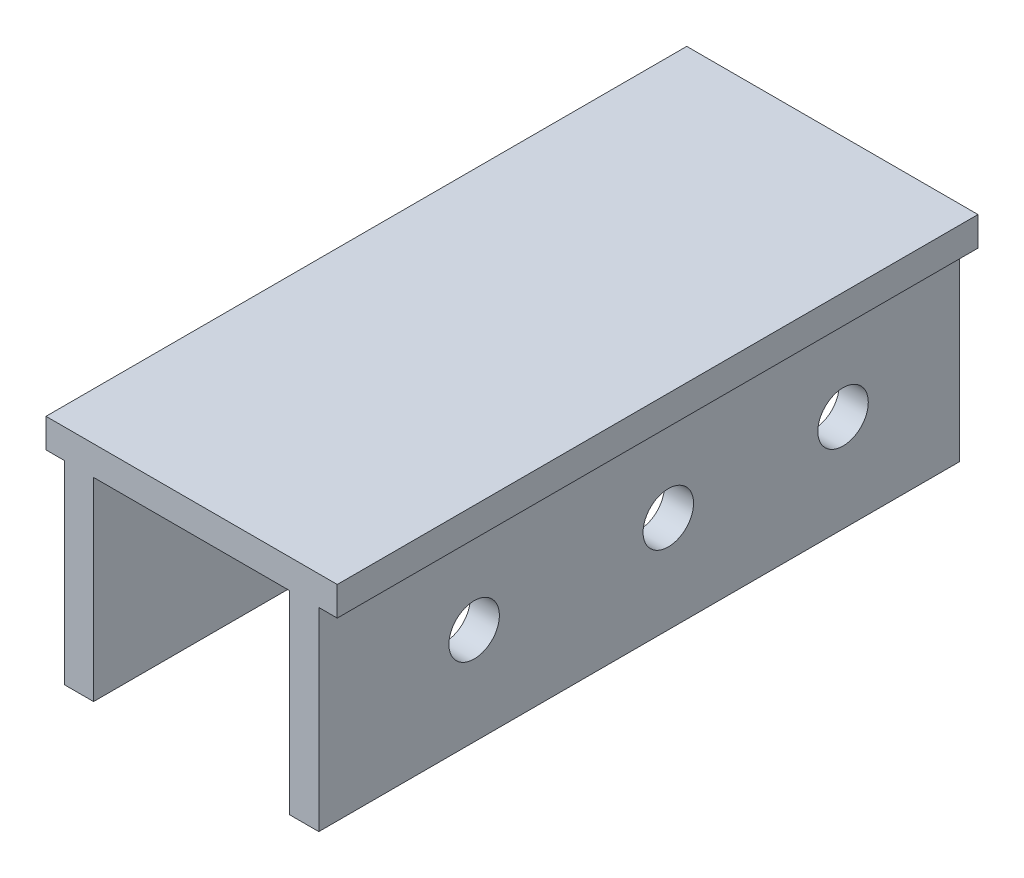
ISO-10303-21;
HEADER;
FILE_DESCRIPTION(('STEP AP214'),'2;1');
FILE_NAME('part.step','',(''),(''),'','','');
FILE_SCHEMA(('AUTOMOTIVE_DESIGN { 1 0 10303 214 1 1 1 1 }'));
ENDSEC;
DATA;
#1=APPLICATION_CONTEXT('core data for automotive mechanical design processes');
#2=APPLICATION_PROTOCOL_DEFINITION('international standard','automotive_design',2000,#1);
#3=PRODUCT_CONTEXT('',#1,'mechanical');
#4=PRODUCT('Part','Part','',(#3));
#5=PRODUCT_RELATED_PRODUCT_CATEGORY('part','',(#4));
#6=PRODUCT_DEFINITION_FORMATION('','',#4);
#7=PRODUCT_DEFINITION_CONTEXT('part definition',#1,'design');
#8=PRODUCT_DEFINITION('design','',#6,#7);
#9=PRODUCT_DEFINITION_SHAPE('','',#8);
#10=(LENGTH_UNIT() NAMED_UNIT(*) SI_UNIT(.MILLI.,.METRE.));
#11=(NAMED_UNIT(*) PLANE_ANGLE_UNIT() SI_UNIT($,.RADIAN.));
#12=(NAMED_UNIT(*) SI_UNIT($,.STERADIAN.) SOLID_ANGLE_UNIT());
#13=UNCERTAINTY_MEASURE_WITH_UNIT(LENGTH_MEASURE(1.E-05),#10,'distance_accuracy_value','');
#14=(GEOMETRIC_REPRESENTATION_CONTEXT(3) GLOBAL_UNCERTAINTY_ASSIGNED_CONTEXT((#13)) GLOBAL_UNIT_ASSIGNED_CONTEXT((#10,
#11,#12)) REPRESENTATION_CONTEXT('',''));
#15=CARTESIAN_POINT('',(0.,0.,0.));
#16=DIRECTION('',(0.,0.,1.));
#17=DIRECTION('',(1.,0.,0.));
#18=AXIS2_PLACEMENT_3D('',#15,#16,#17);
#19=CARTESIAN_POINT('',(15.,-1.5,66.));
#20=DIRECTION('',(-1.,0.,0.));
#21=DIRECTION('',(0.,0.,1.));
#22=AXIS2_PLACEMENT_3D('',#19,#20,#21);
#23=PLANE('',#22);
#24=DIRECTION('',(0.,1.,0.));
#25=VECTOR('',#24,1.);
#26=CARTESIAN_POINT('',(15.,-1.5,0.));
#27=LINE('',#26,#25);
#28=CARTESIAN_POINT('',(15.,-1.5,0.));
#29=VERTEX_POINT('',#28);
#30=CARTESIAN_POINT('',(15.,1.5,0.));
#31=VERTEX_POINT('',#30);
#32=EDGE_CURVE('E160',#29,#31,#27,.T.);
#33=ORIENTED_EDGE('',*,*,#32,.T.);
#34=DIRECTION('',(0.,0.,-1.));
#35=VECTOR('',#34,1.);
#36=CARTESIAN_POINT('',(15.,1.5,66.));
#37=LINE('',#36,#35);
#38=CARTESIAN_POINT('',(15.,1.5,66.));
#39=VERTEX_POINT('',#38);
#40=EDGE_CURVE('E11',#39,#31,#37,.T.);
#41=ORIENTED_EDGE('',*,*,#40,.F.);
#42=DIRECTION('',(0.,1.,0.));
#43=VECTOR('',#42,1.);
#44=CARTESIAN_POINT('',(15.,-1.5,66.));
#45=LINE('',#44,#43);
#46=CARTESIAN_POINT('',(15.,-1.5,66.));
#47=VERTEX_POINT('',#46);
#48=EDGE_CURVE('E183',#47,#39,#45,.T.);
#49=ORIENTED_EDGE('',*,*,#48,.F.);
#50=DIRECTION('',(0.,0.,-1.));
#51=VECTOR('',#50,1.);
#52=CARTESIAN_POINT('',(15.,-1.5,66.));
#53=LINE('',#52,#51);
#54=EDGE_CURVE('E156',#47,#29,#53,.T.);
#55=ORIENTED_EDGE('',*,*,#54,.T.);
#56=EDGE_LOOP('',(#33,#41,#49,#55));
#57=FACE_BOUND('',#56,.T.);
#58=ADVANCED_FACE('F39',(#57),#23,.F.);
#59=CARTESIAN_POINT('',(-15.,1.5,66.));
#60=DIRECTION('',(0.,-1.,0.));
#61=DIRECTION('',(0.,0.,-1.));
#62=AXIS2_PLACEMENT_3D('',#59,#60,#61);
#63=PLANE('',#62);
#64=DIRECTION('',(-1.,0.,0.));
#65=VECTOR('',#64,1.);
#66=CARTESIAN_POINT('',(-15.,1.5,0.));
#67=LINE('',#66,#65);
#68=CARTESIAN_POINT('',(-15.,1.5,0.));
#69=VERTEX_POINT('',#68);
#70=EDGE_CURVE('E163',#31,#69,#67,.T.);
#71=ORIENTED_EDGE('',*,*,#70,.T.);
#72=DIRECTION('',(0.,0.,-1.));
#73=VECTOR('',#72,1.);
#74=CARTESIAN_POINT('',(-15.,1.5,66.));
#75=LINE('',#74,#73);
#76=CARTESIAN_POINT('',(-15.,1.5,66.));
#77=VERTEX_POINT('',#76);
#78=EDGE_CURVE('E48',#77,#69,#75,.T.);
#79=ORIENTED_EDGE('',*,*,#78,.F.);
#80=DIRECTION('',(-1.,0.,0.));
#81=VECTOR('',#80,1.);
#82=CARTESIAN_POINT('',(-15.,1.5,66.));
#83=LINE('',#82,#81);
#84=EDGE_CURVE('E111',#39,#77,#83,.T.);
#85=ORIENTED_EDGE('',*,*,#84,.F.);
#86=ORIENTED_EDGE('',*,*,#40,.T.);
#87=EDGE_LOOP('',(#71,#79,#85,#86));
#88=FACE_BOUND('',#87,.T.);
#89=ADVANCED_FACE('F263',(#88),#63,.F.);
#90=CARTESIAN_POINT('',(-15.,-1.5,66.));
#91=DIRECTION('',(1.,0.,0.));
#92=DIRECTION('',(0.,0.,-1.));
#93=AXIS2_PLACEMENT_3D('',#90,#91,#92);
#94=PLANE('',#93);
#95=DIRECTION('',(0.,-1.,0.));
#96=VECTOR('',#95,1.);
#97=CARTESIAN_POINT('',(-15.,-1.5,0.));
#98=LINE('',#97,#96);
#99=CARTESIAN_POINT('',(-15.,-1.5,0.));
#100=VERTEX_POINT('',#99);
#101=EDGE_CURVE('E166',#69,#100,#98,.T.);
#102=ORIENTED_EDGE('',*,*,#101,.T.);
#103=DIRECTION('',(0.,0.,-1.));
#104=VECTOR('',#103,1.);
#105=CARTESIAN_POINT('',(-15.,-1.5,66.));
#106=LINE('',#105,#104);
#107=CARTESIAN_POINT('',(-15.,-1.5,66.));
#108=VERTEX_POINT('',#107);
#109=EDGE_CURVE('E202',#108,#100,#106,.T.);
#110=ORIENTED_EDGE('',*,*,#109,.F.);
#111=DIRECTION('',(0.,-1.,0.));
#112=VECTOR('',#111,1.);
#113=CARTESIAN_POINT('',(-15.,-1.5,66.));
#114=LINE('',#113,#112);
#115=EDGE_CURVE('E211',#77,#108,#114,.T.);
#116=ORIENTED_EDGE('',*,*,#115,.F.);
#117=ORIENTED_EDGE('',*,*,#78,.T.);
#118=EDGE_LOOP('',(#102,#110,#116,#117));
#119=FACE_BOUND('',#118,.T.);
#120=ADVANCED_FACE('F209',(#119),#94,.F.);
#121=CARTESIAN_POINT('',(-15.,-1.5,66.));
#122=DIRECTION('',(0.,1.,0.));
#123=DIRECTION('',(-1.,0.,0.));
#124=AXIS2_PLACEMENT_3D('',#121,#122,#123);
#125=PLANE('',#124);
#126=DIRECTION('',(1.,0.,0.));
#127=VECTOR('',#126,1.);
#128=CARTESIAN_POINT('',(-15.,-1.5,0.));
#129=LINE('',#128,#127);
#130=CARTESIAN_POINT('',(-13.1,-1.5,0.));
#131=VERTEX_POINT('',#130);
#132=EDGE_CURVE('E168',#100,#131,#129,.T.);
#133=ORIENTED_EDGE('',*,*,#132,.T.);
#134=DIRECTION('',(0.,0.,-1.));
#135=VECTOR('',#134,1.);
#136=CARTESIAN_POINT('',(-13.1,-1.5,66.));
#137=LINE('',#136,#135);
#138=CARTESIAN_POINT('',(-13.1,-1.5,66.));
#139=VERTEX_POINT('',#138);
#140=EDGE_CURVE('E199',#139,#131,#137,.T.);
#141=ORIENTED_EDGE('',*,*,#140,.F.);
#142=DIRECTION('',(1.,0.,0.));
#143=VECTOR('',#142,1.);
#144=CARTESIAN_POINT('',(-15.,-1.5,66.));
#145=LINE('',#144,#143);
#146=EDGE_CURVE('E229',#108,#139,#145,.T.);
#147=ORIENTED_EDGE('',*,*,#146,.F.);
#148=ORIENTED_EDGE('',*,*,#109,.T.);
#149=EDGE_LOOP('',(#133,#141,#147,#148));
#150=FACE_BOUND('',#149,.T.);
#151=ADVANCED_FACE('F220',(#150),#125,.F.);
#152=CARTESIAN_POINT('',(-13.1,-1.5,66.));
#153=DIRECTION('',(1.,0.,0.));
#154=DIRECTION('',(0.,1.,0.));
#155=AXIS2_PLACEMENT_3D('',#152,#153,#154);
#156=PLANE('',#155);
#157=CARTESIAN_POINT('',(-13.1,-11.5,50.));
#158=DIRECTION('',(1.,0.,0.));
#159=DIRECTION('',(0.,1.,0.));
#160=AXIS2_PLACEMENT_3D('',#157,#158,#159);
#161=CIRCLE('',#160,2.60000000000001);
#162=CARTESIAN_POINT('',(-13.1,-8.9,50.));
#163=VERTEX_POINT('',#162);
#164=EDGE_CURVE('E473',#163,#163,#161,.T.);
#165=ORIENTED_EDGE('',*,*,#164,.T.);
#166=EDGE_LOOP('',(#165));
#167=FACE_BOUND('',#166,.T.);
#168=CARTESIAN_POINT('',(-13.1,-11.5,30.));
#169=DIRECTION('',(1.,0.,0.));
#170=DIRECTION('',(0.,1.,0.));
#171=AXIS2_PLACEMENT_3D('',#168,#169,#170);
#172=CIRCLE('',#171,2.60000000000001);
#173=CARTESIAN_POINT('',(-13.1,-8.9,30.));
#174=VERTEX_POINT('',#173);
#175=EDGE_CURVE('E488',#174,#174,#172,.T.);
#176=ORIENTED_EDGE('',*,*,#175,.T.);
#177=EDGE_LOOP('',(#176));
#178=FACE_BOUND('',#177,.T.);
#179=CARTESIAN_POINT('',(-13.1,-11.5,12.));
#180=DIRECTION('',(1.,0.,0.));
#181=DIRECTION('',(0.,1.,0.));
#182=AXIS2_PLACEMENT_3D('',#179,#180,#181);
#183=CIRCLE('',#182,2.60000000000001);
#184=CARTESIAN_POINT('',(-13.1,-8.89999999999999,12.));
#185=VERTEX_POINT('',#184);
#186=EDGE_CURVE('E164',#185,#185,#183,.T.);
#187=ORIENTED_EDGE('',*,*,#186,.T.);
#188=EDGE_LOOP('',(#187));
#189=FACE_BOUND('',#188,.T.);
#190=DIRECTION('',(0.,-1.,0.));
#191=VECTOR('',#190,1.);
#192=CARTESIAN_POINT('',(-13.1,-1.5,0.));
#193=LINE('',#192,#191);
#194=CARTESIAN_POINT('',(-13.1,-21.5,0.));
#195=VERTEX_POINT('',#194);
#196=EDGE_CURVE('E170',#131,#195,#193,.T.);
#197=ORIENTED_EDGE('',*,*,#196,.T.);
#198=DIRECTION('',(0.,0.,-1.));
#199=VECTOR('',#198,1.);
#200=CARTESIAN_POINT('',(-13.1,-21.5,66.));
#201=LINE('',#200,#199);
#202=CARTESIAN_POINT('',(-13.1,-21.5,66.));
#203=VERTEX_POINT('',#202);
#204=EDGE_CURVE('E196',#203,#195,#201,.T.);
#205=ORIENTED_EDGE('',*,*,#204,.F.);
#206=DIRECTION('',(0.,-1.,0.));
#207=VECTOR('',#206,1.);
#208=CARTESIAN_POINT('',(-13.1,-1.5,66.));
#209=LINE('',#208,#207);
#210=EDGE_CURVE('E226',#139,#203,#209,.T.);
#211=ORIENTED_EDGE('',*,*,#210,.F.);
#212=ORIENTED_EDGE('',*,*,#140,.T.);
#213=EDGE_LOOP('',(#197,#205,#211,#212));
#214=FACE_BOUND('',#213,.T.);
#215=ADVANCED_FACE('F224',(#167,#178,#189,#214),#156,.F.);
#216=CARTESIAN_POINT('',(-13.1,-21.5,66.));
#217=DIRECTION('',(0.,1.,0.));
#218=DIRECTION('',(0.,0.,1.));
#219=AXIS2_PLACEMENT_3D('',#216,#217,#218);
#220=PLANE('',#219);
#221=DIRECTION('',(1.,0.,0.));
#222=VECTOR('',#221,1.);
#223=CARTESIAN_POINT('',(-13.1,-21.5,0.));
#224=LINE('',#223,#222);
#225=CARTESIAN_POINT('',(-10.1,-21.5,0.));
#226=VERTEX_POINT('',#225);
#227=EDGE_CURVE('E172',#195,#226,#224,.T.);
#228=ORIENTED_EDGE('',*,*,#227,.T.);
#229=DIRECTION('',(0.,0.,-1.));
#230=VECTOR('',#229,1.);
#231=CARTESIAN_POINT('',(-10.1,-21.5,66.));
#232=LINE('',#231,#230);
#233=CARTESIAN_POINT('',(-10.1,-21.5,66.));
#234=VERTEX_POINT('',#233);
#235=EDGE_CURVE('E193',#234,#226,#232,.T.);
#236=ORIENTED_EDGE('',*,*,#235,.F.);
#237=DIRECTION('',(1.,0.,0.));
#238=VECTOR('',#237,1.);
#239=CARTESIAN_POINT('',(-13.1,-21.5,66.));
#240=LINE('',#239,#238);
#241=EDGE_CURVE('E228',#203,#234,#240,.T.);
#242=ORIENTED_EDGE('',*,*,#241,.F.);
#243=ORIENTED_EDGE('',*,*,#204,.T.);
#244=EDGE_LOOP('',(#228,#236,#242,#243));
#245=FACE_BOUND('',#244,.T.);
#246=ADVANCED_FACE('F276',(#245),#220,.F.);
#247=CARTESIAN_POINT('',(-10.1,-1.5,66.));
#248=DIRECTION('',(-1.,0.,0.));
#249=DIRECTION('',(0.,-1.,0.));
#250=AXIS2_PLACEMENT_3D('',#247,#248,#249);
#251=PLANE('',#250);
#252=CARTESIAN_POINT('',(-10.1,-11.5,50.));
#253=DIRECTION('',(-1.,0.,0.));
#254=DIRECTION('',(0.,-1.,0.));
#255=AXIS2_PLACEMENT_3D('',#252,#253,#254);
#256=CIRCLE('',#255,2.60000000000001);
#257=CARTESIAN_POINT('',(-10.1,-14.1,50.));
#258=VERTEX_POINT('',#257);
#259=EDGE_CURVE('E470',#258,#258,#256,.T.);
#260=ORIENTED_EDGE('',*,*,#259,.T.);
#261=EDGE_LOOP('',(#260));
#262=FACE_BOUND('',#261,.T.);
#263=CARTESIAN_POINT('',(-10.1,-11.5,30.));
#264=DIRECTION('',(-1.,0.,0.));
#265=DIRECTION('',(0.,-1.,0.));
#266=AXIS2_PLACEMENT_3D('',#263,#264,#265);
#267=CIRCLE('',#266,2.60000000000001);
#268=CARTESIAN_POINT('',(-10.1,-14.1,30.));
#269=VERTEX_POINT('',#268);
#270=EDGE_CURVE('E485',#269,#269,#267,.T.);
#271=ORIENTED_EDGE('',*,*,#270,.T.);
#272=EDGE_LOOP('',(#271));
#273=FACE_BOUND('',#272,.T.);
#274=CARTESIAN_POINT('',(-10.1,-11.5,12.));
#275=DIRECTION('',(-1.,0.,0.));
#276=DIRECTION('',(0.,-1.,0.));
#277=AXIS2_PLACEMENT_3D('',#274,#275,#276);
#278=CIRCLE('',#277,2.60000000000001);
#279=CARTESIAN_POINT('',(-10.1,-14.1,12.));
#280=VERTEX_POINT('',#279);
#281=EDGE_CURVE('E494',#280,#280,#278,.T.);
#282=ORIENTED_EDGE('',*,*,#281,.T.);
#283=EDGE_LOOP('',(#282));
#284=FACE_BOUND('',#283,.T.);
#285=DIRECTION('',(0.,1.,0.));
#286=VECTOR('',#285,1.);
#287=CARTESIAN_POINT('',(-10.1,-1.5,0.));
#288=LINE('',#287,#286);
#289=CARTESIAN_POINT('',(-10.1,-1.5,0.));
#290=VERTEX_POINT('',#289);
#291=EDGE_CURVE('E174',#226,#290,#288,.T.);
#292=ORIENTED_EDGE('',*,*,#291,.T.);
#293=DIRECTION('',(0.,0.,-1.));
#294=VECTOR('',#293,1.);
#295=CARTESIAN_POINT('',(-10.1,-1.5,66.));
#296=LINE('',#295,#294);
#297=CARTESIAN_POINT('',(-10.1,-1.5,66.));
#298=VERTEX_POINT('',#297);
#299=EDGE_CURVE('E190',#298,#290,#296,.T.);
#300=ORIENTED_EDGE('',*,*,#299,.F.);
#301=DIRECTION('',(0.,1.,0.));
#302=VECTOR('',#301,1.);
#303=CARTESIAN_POINT('',(-10.1,-1.5,66.));
#304=LINE('',#303,#302);
#305=EDGE_CURVE('E231',#234,#298,#304,.T.);
#306=ORIENTED_EDGE('',*,*,#305,.F.);
#307=ORIENTED_EDGE('',*,*,#235,.T.);
#308=EDGE_LOOP('',(#292,#300,#306,#307));
#309=FACE_BOUND('',#308,.T.);
#310=ADVANCED_FACE('F280',(#262,#273,#284,#309),#251,.F.);
#311=CARTESIAN_POINT('',(-10.1,-1.5,66.));
#312=DIRECTION('',(0.,1.,0.));
#313=DIRECTION('',(-1.,0.,0.));
#314=AXIS2_PLACEMENT_3D('',#311,#312,#313);
#315=PLANE('',#314);
#316=DIRECTION('',(1.,0.,0.));
#317=VECTOR('',#316,1.);
#318=CARTESIAN_POINT('',(-10.1,-1.5,0.));
#319=LINE('',#318,#317);
#320=CARTESIAN_POINT('',(10.1,-1.5,0.));
#321=VERTEX_POINT('',#320);
#322=EDGE_CURVE('E176',#290,#321,#319,.T.);
#323=ORIENTED_EDGE('',*,*,#322,.T.);
#324=DIRECTION('',(0.,0.,-1.));
#325=VECTOR('',#324,1.);
#326=CARTESIAN_POINT('',(10.1,-1.5,66.));
#327=LINE('',#326,#325);
#328=CARTESIAN_POINT('',(10.1,-1.5,66.));
#329=VERTEX_POINT('',#328);
#330=EDGE_CURVE('E187',#329,#321,#327,.T.);
#331=ORIENTED_EDGE('',*,*,#330,.F.);
#332=DIRECTION('',(1.,0.,0.));
#333=VECTOR('',#332,1.);
#334=CARTESIAN_POINT('',(-10.1,-1.5,66.));
#335=LINE('',#334,#333);
#336=EDGE_CURVE('E237',#298,#329,#335,.T.);
#337=ORIENTED_EDGE('',*,*,#336,.F.);
#338=ORIENTED_EDGE('',*,*,#299,.T.);
#339=EDGE_LOOP('',(#323,#331,#337,#338));
#340=FACE_BOUND('',#339,.T.);
#341=ADVANCED_FACE('F243',(#340),#315,.F.);
#342=CARTESIAN_POINT('',(10.1,-1.5,66.));
#343=DIRECTION('',(1.,0.,0.));
#344=DIRECTION('',(0.,1.,0.));
#345=AXIS2_PLACEMENT_3D('',#342,#343,#344);
#346=PLANE('',#345);
#347=CARTESIAN_POINT('',(10.1,-11.5,50.));
#348=DIRECTION('',(1.,0.,0.));
#349=DIRECTION('',(0.,1.,0.));
#350=AXIS2_PLACEMENT_3D('',#347,#348,#349);
#351=CIRCLE('',#350,2.60000000000001);
#352=CARTESIAN_POINT('',(10.1,-8.9,50.));
#353=VERTEX_POINT('',#352);
#354=EDGE_CURVE('E479',#353,#353,#351,.T.);
#355=ORIENTED_EDGE('',*,*,#354,.T.);
#356=EDGE_LOOP('',(#355));
#357=FACE_BOUND('',#356,.T.);
#358=CARTESIAN_POINT('',(10.1,-11.5,30.));
#359=DIRECTION('',(1.,0.,0.));
#360=DIRECTION('',(0.,1.,0.));
#361=AXIS2_PLACEMENT_3D('',#358,#359,#360);
#362=CIRCLE('',#361,2.60000000000001);
#363=CARTESIAN_POINT('',(10.1,-8.9,30.));
#364=VERTEX_POINT('',#363);
#365=EDGE_CURVE('E477',#364,#364,#362,.T.);
#366=ORIENTED_EDGE('',*,*,#365,.T.);
#367=EDGE_LOOP('',(#366));
#368=FACE_BOUND('',#367,.T.);
#369=CARTESIAN_POINT('',(10.1,-11.5,12.));
#370=DIRECTION('',(1.,0.,0.));
#371=DIRECTION('',(0.,1.,0.));
#372=AXIS2_PLACEMENT_3D('',#369,#370,#371);
#373=CIRCLE('',#372,2.60000000000001);
#374=CARTESIAN_POINT('',(10.1,-8.89999999999999,12.));
#375=VERTEX_POINT('',#374);
#376=EDGE_CURVE('E42',#375,#375,#373,.T.);
#377=ORIENTED_EDGE('',*,*,#376,.T.);
#378=EDGE_LOOP('',(#377));
#379=FACE_BOUND('',#378,.T.);
#380=DIRECTION('',(0.,-1.,0.));
#381=VECTOR('',#380,1.);
#382=CARTESIAN_POINT('',(10.1,-1.5,0.));
#383=LINE('',#382,#381);
#384=CARTESIAN_POINT('',(10.1,-21.5,0.));
#385=VERTEX_POINT('',#384);
#386=EDGE_CURVE('E178',#321,#385,#383,.T.);
#387=ORIENTED_EDGE('',*,*,#386,.T.);
#388=DIRECTION('',(0.,0.,-1.));
#389=VECTOR('',#388,1.);
#390=CARTESIAN_POINT('',(10.1,-21.5,66.));
#391=LINE('',#390,#389);
#392=CARTESIAN_POINT('',(10.1,-21.5,66.));
#393=VERTEX_POINT('',#392);
#394=EDGE_CURVE('E151',#393,#385,#391,.T.);
#395=ORIENTED_EDGE('',*,*,#394,.F.);
#396=DIRECTION('',(0.,-1.,0.));
#397=VECTOR('',#396,1.);
#398=CARTESIAN_POINT('',(10.1,-1.5,66.));
#399=LINE('',#398,#397);
#400=EDGE_CURVE('E142',#329,#393,#399,.T.);
#401=ORIENTED_EDGE('',*,*,#400,.F.);
#402=ORIENTED_EDGE('',*,*,#330,.T.);
#403=EDGE_LOOP('',(#387,#395,#401,#402));
#404=FACE_BOUND('',#403,.T.);
#405=ADVANCED_FACE('F247',(#357,#368,#379,#404),#346,.F.);
#406=CARTESIAN_POINT('',(10.1,-21.5,66.));
#407=DIRECTION('',(0.,1.,0.));
#408=DIRECTION('',(0.,0.,1.));
#409=AXIS2_PLACEMENT_3D('',#406,#407,#408);
#410=PLANE('',#409);
#411=DIRECTION('',(1.,0.,0.));
#412=VECTOR('',#411,1.);
#413=CARTESIAN_POINT('',(10.1,-21.5,0.));
#414=LINE('',#413,#412);
#415=CARTESIAN_POINT('',(13.1,-21.5,0.));
#416=VERTEX_POINT('',#415);
#417=EDGE_CURVE('E150',#385,#416,#414,.T.);
#418=ORIENTED_EDGE('',*,*,#417,.T.);
#419=DIRECTION('',(0.,0.,-1.));
#420=VECTOR('',#419,1.);
#421=CARTESIAN_POINT('',(13.1,-21.5,66.));
#422=LINE('',#421,#420);
#423=CARTESIAN_POINT('',(13.1,-21.5,66.));
#424=VERTEX_POINT('',#423);
#425=EDGE_CURVE('E147',#424,#416,#422,.T.);
#426=ORIENTED_EDGE('',*,*,#425,.F.);
#427=DIRECTION('',(1.,0.,0.));
#428=VECTOR('',#427,1.);
#429=CARTESIAN_POINT('',(10.1,-21.5,66.));
#430=LINE('',#429,#428);
#431=EDGE_CURVE('E136',#393,#424,#430,.T.);
#432=ORIENTED_EDGE('',*,*,#431,.F.);
#433=ORIENTED_EDGE('',*,*,#394,.T.);
#434=EDGE_LOOP('',(#418,#426,#432,#433));
#435=FACE_BOUND('',#434,.T.);
#436=ADVANCED_FACE('F148',(#435),#410,.F.);
#437=CARTESIAN_POINT('',(13.1,-1.5,66.));
#438=DIRECTION('',(-1.,0.,0.));
#439=DIRECTION('',(0.,-1.,0.));
#440=AXIS2_PLACEMENT_3D('',#437,#438,#439);
#441=PLANE('',#440);
#442=CARTESIAN_POINT('',(13.1,-11.5,50.));
#443=DIRECTION('',(1.,0.,0.));
#444=DIRECTION('',(0.,0.,-1.));
#445=AXIS2_PLACEMENT_3D('',#442,#443,#444);
#446=CIRCLE('',#445,2.60000000000001);
#447=CARTESIAN_POINT('',(13.1,-11.5,47.4));
#448=VERTEX_POINT('',#447);
#449=EDGE_CURVE('E524',#448,#448,#446,.T.);
#450=ORIENTED_EDGE('',*,*,#449,.F.);
#451=EDGE_LOOP('',(#450));
#452=FACE_BOUND('',#451,.T.);
#453=CARTESIAN_POINT('',(13.1,-11.5,30.));
#454=DIRECTION('',(1.,0.,0.));
#455=DIRECTION('',(0.,0.,-1.));
#456=AXIS2_PLACEMENT_3D('',#453,#454,#455);
#457=CIRCLE('',#456,2.60000000000001);
#458=CARTESIAN_POINT('',(13.1,-11.5,27.4));
#459=VERTEX_POINT('',#458);
#460=EDGE_CURVE('E474',#459,#459,#457,.T.);
#461=ORIENTED_EDGE('',*,*,#460,.F.);
#462=EDGE_LOOP('',(#461));
#463=FACE_BOUND('',#462,.T.);
#464=CARTESIAN_POINT('',(13.1,-11.5,12.));
#465=DIRECTION('',(1.,0.,0.));
#466=DIRECTION('',(0.,0.,-1.));
#467=AXIS2_PLACEMENT_3D('',#464,#465,#466);
#468=CIRCLE('',#467,2.60000000000001);
#469=CARTESIAN_POINT('',(13.1,-11.5,9.39999999999998));
#470=VERTEX_POINT('',#469);
#471=EDGE_CURVE('E491',#470,#470,#468,.T.);
#472=ORIENTED_EDGE('',*,*,#471,.F.);
#473=EDGE_LOOP('',(#472));
#474=FACE_BOUND('',#473,.T.);
#475=DIRECTION('',(0.,1.,0.));
#476=VECTOR('',#475,1.);
#477=CARTESIAN_POINT('',(13.1,-1.5,0.));
#478=LINE('',#477,#476);
#479=CARTESIAN_POINT('',(13.1,-1.5,0.));
#480=VERTEX_POINT('',#479);
#481=EDGE_CURVE('E97',#416,#480,#478,.T.);
#482=ORIENTED_EDGE('',*,*,#481,.T.);
#483=DIRECTION('',(0.,0.,-1.));
#484=VECTOR('',#483,1.);
#485=CARTESIAN_POINT('',(13.1,-1.5,66.));
#486=LINE('',#485,#484);
#487=CARTESIAN_POINT('',(13.1,-1.5,66.));
#488=VERTEX_POINT('',#487);
#489=EDGE_CURVE('E152',#488,#480,#486,.T.);
#490=ORIENTED_EDGE('',*,*,#489,.F.);
#491=DIRECTION('',(0.,1.,0.));
#492=VECTOR('',#491,1.);
#493=CARTESIAN_POINT('',(13.1,-1.5,66.));
#494=LINE('',#493,#492);
#495=EDGE_CURVE('E140',#424,#488,#494,.T.);
#496=ORIENTED_EDGE('',*,*,#495,.F.);
#497=ORIENTED_EDGE('',*,*,#425,.T.);
#498=EDGE_LOOP('',(#482,#490,#496,#497));
#499=FACE_BOUND('',#498,.T.);
#500=ADVANCED_FACE('F154',(#452,#463,#474,#499),#441,.F.);
#501=CARTESIAN_POINT('',(13.1,-1.5,66.));
#502=DIRECTION('',(0.,1.,0.));
#503=DIRECTION('',(-1.,0.,0.));
#504=AXIS2_PLACEMENT_3D('',#501,#502,#503);
#505=PLANE('',#504);
#506=DIRECTION('',(1.,0.,0.));
#507=VECTOR('',#506,1.);
#508=CARTESIAN_POINT('',(13.1,-1.5,0.));
#509=LINE('',#508,#507);
#510=EDGE_CURVE('E103',#480,#29,#509,.T.);
#511=ORIENTED_EDGE('',*,*,#510,.T.);
#512=ORIENTED_EDGE('',*,*,#54,.F.);
#513=DIRECTION('',(1.,0.,0.));
#514=VECTOR('',#513,1.);
#515=CARTESIAN_POINT('',(13.1,-1.5,66.));
#516=LINE('',#515,#514);
#517=EDGE_CURVE('E56',#488,#47,#516,.T.);
#518=ORIENTED_EDGE('',*,*,#517,.F.);
#519=ORIENTED_EDGE('',*,*,#489,.T.);
#520=EDGE_LOOP('',(#511,#512,#518,#519));
#521=FACE_BOUND('',#520,.T.);
#522=ADVANCED_FACE('F251',(#521),#505,.F.);
#523=CARTESIAN_POINT('',(0.,0.,66.));
#524=DIRECTION('',(0.,0.,-1.));
#525=DIRECTION('',(-1.,0.,0.));
#526=AXIS2_PLACEMENT_3D('',#523,#524,#525);
#527=PLANE('',#526);
#528=ORIENTED_EDGE('',*,*,#48,.T.);
#529=ORIENTED_EDGE('',*,*,#84,.T.);
#530=ORIENTED_EDGE('',*,*,#115,.T.);
#531=ORIENTED_EDGE('',*,*,#146,.T.);
#532=ORIENTED_EDGE('',*,*,#210,.T.);
#533=ORIENTED_EDGE('',*,*,#241,.T.);
#534=ORIENTED_EDGE('',*,*,#305,.T.);
#535=ORIENTED_EDGE('',*,*,#336,.T.);
#536=ORIENTED_EDGE('',*,*,#400,.T.);
#537=ORIENTED_EDGE('',*,*,#431,.T.);
#538=ORIENTED_EDGE('',*,*,#495,.T.);
#539=ORIENTED_EDGE('',*,*,#517,.T.);
#540=EDGE_LOOP('',(#528,#529,#530,#531,#532,#533,#534,#535,#536,#537,#538,#539));
#541=FACE_BOUND('',#540,.T.);
#542=ADVANCED_FACE('F138',(#541),#527,.F.);
#543=CARTESIAN_POINT('',(0.,0.,0.));
#544=DIRECTION('',(0.,0.,-1.));
#545=DIRECTION('',(-1.,0.,0.));
#546=AXIS2_PLACEMENT_3D('',#543,#544,#545);
#547=PLANE('',#546);
#548=ORIENTED_EDGE('',*,*,#32,.F.);
#549=ORIENTED_EDGE('',*,*,#510,.F.);
#550=ORIENTED_EDGE('',*,*,#481,.F.);
#551=ORIENTED_EDGE('',*,*,#417,.F.);
#552=ORIENTED_EDGE('',*,*,#386,.F.);
#553=ORIENTED_EDGE('',*,*,#322,.F.);
#554=ORIENTED_EDGE('',*,*,#291,.F.);
#555=ORIENTED_EDGE('',*,*,#227,.F.);
#556=ORIENTED_EDGE('',*,*,#196,.F.);
#557=ORIENTED_EDGE('',*,*,#132,.F.);
#558=ORIENTED_EDGE('',*,*,#101,.F.);
#559=ORIENTED_EDGE('',*,*,#70,.F.);
#560=EDGE_LOOP('',(#548,#549,#550,#551,#552,#553,#554,#555,#556,#557,#558,#559));
#561=FACE_BOUND('',#560,.T.);
#562=ADVANCED_FACE('F215',(#561),#547,.T.);
#563=CARTESIAN_POINT('',(13.1,-11.5,12.));
#564=DIRECTION('',(1.,0.,0.));
#565=DIRECTION('',(0.,0.,-1.));
#566=AXIS2_PLACEMENT_3D('',#563,#564,#565);
#567=CYLINDRICAL_SURFACE('',#566,2.60000000000001);
#568=ORIENTED_EDGE('',*,*,#471,.T.);
#569=EDGE_LOOP('',(#568));
#570=FACE_BOUND('',#569,.T.);
#571=ORIENTED_EDGE('',*,*,#376,.F.);
#572=EDGE_LOOP('',(#571));
#573=FACE_BOUND('',#572,.T.);
#574=ADVANCED_FACE('F310',(#570,#573),#567,.F.);
#575=ORIENTED_EDGE('',*,*,#281,.F.);
#576=EDGE_LOOP('',(#575));
#577=FACE_BOUND('',#576,.T.);
#578=ORIENTED_EDGE('',*,*,#186,.F.);
#579=EDGE_LOOP('',(#578));
#580=FACE_BOUND('',#579,.T.);
#581=ADVANCED_FACE('F315',(#577,#580),#567,.F.);
#582=CARTESIAN_POINT('',(13.1,-11.5,30.));
#583=DIRECTION('',(1.,0.,0.));
#584=DIRECTION('',(0.,0.,-1.));
#585=AXIS2_PLACEMENT_3D('',#582,#583,#584);
#586=CYLINDRICAL_SURFACE('',#585,2.60000000000001);
#587=ORIENTED_EDGE('',*,*,#460,.T.);
#588=EDGE_LOOP('',(#587));
#589=FACE_BOUND('',#588,.T.);
#590=ORIENTED_EDGE('',*,*,#365,.F.);
#591=EDGE_LOOP('',(#590));
#592=FACE_BOUND('',#591,.T.);
#593=ADVANCED_FACE('F328',(#589,#592),#586,.F.);
#594=ORIENTED_EDGE('',*,*,#270,.F.);
#595=EDGE_LOOP('',(#594));
#596=FACE_BOUND('',#595,.T.);
#597=ORIENTED_EDGE('',*,*,#175,.F.);
#598=EDGE_LOOP('',(#597));
#599=FACE_BOUND('',#598,.T.);
#600=ADVANCED_FACE('F338',(#596,#599),#586,.F.);
#601=CARTESIAN_POINT('',(13.1,-11.5,50.));
#602=DIRECTION('',(1.,0.,0.));
#603=DIRECTION('',(0.,0.,-1.));
#604=AXIS2_PLACEMENT_3D('',#601,#602,#603);
#605=CYLINDRICAL_SURFACE('',#604,2.60000000000001);
#606=ORIENTED_EDGE('',*,*,#449,.T.);
#607=EDGE_LOOP('',(#606));
#608=FACE_BOUND('',#607,.T.);
#609=ORIENTED_EDGE('',*,*,#354,.F.);
#610=EDGE_LOOP('',(#609));
#611=FACE_BOUND('',#610,.T.);
#612=ADVANCED_FACE('F349',(#608,#611),#605,.F.);
#613=ORIENTED_EDGE('',*,*,#259,.F.);
#614=EDGE_LOOP('',(#613));
#615=FACE_BOUND('',#614,.T.);
#616=ORIENTED_EDGE('',*,*,#164,.F.);
#617=EDGE_LOOP('',(#616));
#618=FACE_BOUND('',#617,.T.);
#619=ADVANCED_FACE('F359',(#615,#618),#605,.F.);
#620=CLOSED_SHELL('',(#58,#89,#120,#151,#215,#246,#310,#341,#405,#436,#500,#522,#542,#562,#574,
#581,#593,#600,#612,#619));
#621=MANIFOLD_SOLID_BREP('B2',#620);
#622=ADVANCED_BREP_SHAPE_REPRESENTATION('',(#18,#621),#14);
#623=SHAPE_DEFINITION_REPRESENTATION(#9,#622);
ENDSEC;
END-ISO-10303-21;
